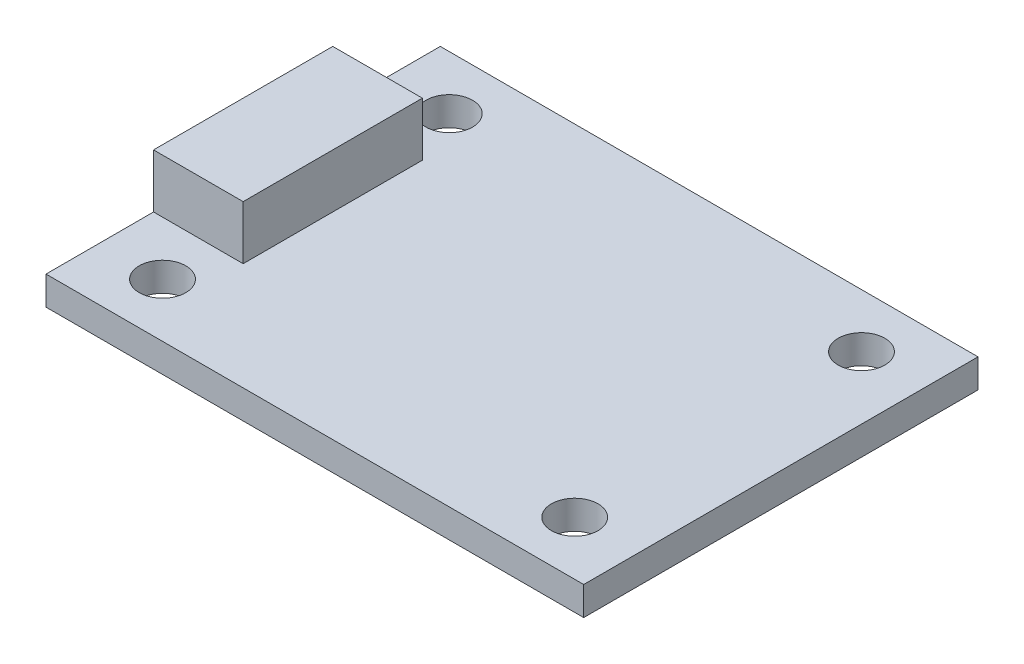
ISO-10303-21;
HEADER;
FILE_DESCRIPTION(('STEP AP214'),'2;1');
FILE_NAME('part.step','',(''),(''),'','','');
FILE_SCHEMA(('AUTOMOTIVE_DESIGN { 1 0 10303 214 1 1 1 1 }'));
ENDSEC;
DATA;
#1=APPLICATION_CONTEXT('core data for automotive mechanical design processes');
#2=APPLICATION_PROTOCOL_DEFINITION('international standard','automotive_design',2000,#1);
#3=PRODUCT_CONTEXT('',#1,'mechanical');
#4=PRODUCT('Part','Part','',(#3));
#5=PRODUCT_RELATED_PRODUCT_CATEGORY('part','',(#4));
#6=PRODUCT_DEFINITION_FORMATION('','',#4);
#7=PRODUCT_DEFINITION_CONTEXT('part definition',#1,'design');
#8=PRODUCT_DEFINITION('design','',#6,#7);
#9=PRODUCT_DEFINITION_SHAPE('','',#8);
#10=(LENGTH_UNIT() NAMED_UNIT(*) SI_UNIT(.MILLI.,.METRE.));
#11=(NAMED_UNIT(*) PLANE_ANGLE_UNIT() SI_UNIT($,.RADIAN.));
#12=(NAMED_UNIT(*) SI_UNIT($,.STERADIAN.) SOLID_ANGLE_UNIT());
#13=UNCERTAINTY_MEASURE_WITH_UNIT(LENGTH_MEASURE(1.E-05),#10,'distance_accuracy_value','');
#14=(GEOMETRIC_REPRESENTATION_CONTEXT(3) GLOBAL_UNCERTAINTY_ASSIGNED_CONTEXT((#13)) GLOBAL_UNIT_ASSIGNED_CONTEXT((#10,
#11,#12)) REPRESENTATION_CONTEXT('',''));
#15=CARTESIAN_POINT('',(0.,0.,0.));
#16=DIRECTION('',(0.,0.,1.));
#17=DIRECTION('',(1.,0.,0.));
#18=AXIS2_PLACEMENT_3D('',#15,#16,#17);
#19=CARTESIAN_POINT('',(0.,1.6,0.));
#20=DIRECTION('',(0.,-1.,0.));
#21=DIRECTION('',(0.,0.,-1.));
#22=AXIS2_PLACEMENT_3D('',#19,#20,#21);
#23=PLANE('',#22);
#24=CARTESIAN_POINT('',(3.49999999999999,1.6,-19.));
#25=DIRECTION('',(0.,1.,0.));
#26=DIRECTION('',(0.,0.,-1.));
#27=AXIS2_PLACEMENT_3D('',#24,#25,#26);
#28=CIRCLE('',#27,1.3);
#29=CARTESIAN_POINT('',(3.49999999999999,1.6,-20.3));
#30=VERTEX_POINT('',#29);
#31=EDGE_CURVE('E129',#30,#30,#28,.T.);
#32=ORIENTED_EDGE('',*,*,#31,.F.);
#33=EDGE_LOOP('',(#32));
#34=FACE_BOUND('',#33,.T.);
#35=CARTESIAN_POINT('',(26.5,1.6,-19.));
#36=DIRECTION('',(0.,1.,0.));
#37=DIRECTION('',(0.,0.,-1.));
#38=AXIS2_PLACEMENT_3D('',#35,#36,#37);
#39=CIRCLE('',#38,1.3);
#40=CARTESIAN_POINT('',(26.5,1.6,-20.3));
#41=VERTEX_POINT('',#40);
#42=EDGE_CURVE('E138',#41,#41,#39,.T.);
#43=ORIENTED_EDGE('',*,*,#42,.F.);
#44=EDGE_LOOP('',(#43));
#45=FACE_BOUND('',#44,.T.);
#46=CARTESIAN_POINT('',(26.5,1.6,-3.));
#47=DIRECTION('',(0.,1.,0.));
#48=DIRECTION('',(0.,0.,1.));
#49=AXIS2_PLACEMENT_3D('',#46,#47,#48);
#50=CIRCLE('',#49,1.3);
#51=CARTESIAN_POINT('',(26.5,1.6,-1.7));
#52=VERTEX_POINT('',#51);
#53=EDGE_CURVE('E144',#52,#52,#50,.T.);
#54=ORIENTED_EDGE('',*,*,#53,.F.);
#55=EDGE_LOOP('',(#54));
#56=FACE_BOUND('',#55,.T.);
#57=CARTESIAN_POINT('',(3.49999999999999,1.6,-3.));
#58=DIRECTION('',(0.,1.,0.));
#59=DIRECTION('',(0.,0.,1.));
#60=AXIS2_PLACEMENT_3D('',#57,#58,#59);
#61=CIRCLE('',#60,1.3);
#62=CARTESIAN_POINT('',(3.49999999999999,1.6,-1.7));
#63=VERTEX_POINT('',#62);
#64=EDGE_CURVE('E150',#63,#63,#61,.T.);
#65=ORIENTED_EDGE('',*,*,#64,.F.);
#66=EDGE_LOOP('',(#65));
#67=FACE_BOUND('',#66,.T.);
#68=DIRECTION('',(-1.,0.,0.));
#69=VECTOR('',#68,1.);
#70=CARTESIAN_POINT('',(0.,1.6,-16.));
#71=LINE('',#70,#69);
#72=CARTESIAN_POINT('',(5.,1.6,-16.));
#73=VERTEX_POINT('',#72);
#74=CARTESIAN_POINT('',(0.,1.6,-16.));
#75=VERTEX_POINT('',#74);
#76=EDGE_CURVE('E54',#73,#75,#71,.T.);
#77=ORIENTED_EDGE('',*,*,#76,.F.);
#78=DIRECTION('',(0.,0.,-1.));
#79=VECTOR('',#78,1.);
#80=CARTESIAN_POINT('',(5.,1.6,-16.));
#81=LINE('',#80,#79);
#82=CARTESIAN_POINT('',(5.,1.6,-5.99999999999999));
#83=VERTEX_POINT('',#82);
#84=EDGE_CURVE('E200',#83,#73,#81,.T.);
#85=ORIENTED_EDGE('',*,*,#84,.F.);
#86=DIRECTION('',(1.,0.,0.));
#87=VECTOR('',#86,1.);
#88=CARTESIAN_POINT('',(0.,1.6,-5.99999999999999));
#89=LINE('',#88,#87);
#90=CARTESIAN_POINT('',(0.,1.6,-5.99999999999999));
#91=VERTEX_POINT('',#90);
#92=EDGE_CURVE('E60',#91,#83,#89,.T.);
#93=ORIENTED_EDGE('',*,*,#92,.F.);
#94=DIRECTION('',(0.,0.,1.));
#95=VECTOR('',#94,1.);
#96=CARTESIAN_POINT('',(0.,1.6,0.));
#97=LINE('',#96,#95);
#98=CARTESIAN_POINT('',(0.,1.6,0.));
#99=VERTEX_POINT('',#98);
#100=EDGE_CURVE('E125',#91,#99,#97,.T.);
#101=ORIENTED_EDGE('',*,*,#100,.T.);
#102=DIRECTION('',(1.,0.,0.));
#103=VECTOR('',#102,1.);
#104=CARTESIAN_POINT('',(0.,1.6,0.));
#105=LINE('',#104,#103);
#106=CARTESIAN_POINT('',(30.,1.6,0.));
#107=VERTEX_POINT('',#106);
#108=EDGE_CURVE('E158',#99,#107,#105,.T.);
#109=ORIENTED_EDGE('',*,*,#108,.T.);
#110=DIRECTION('',(0.,0.,-1.));
#111=VECTOR('',#110,1.);
#112=CARTESIAN_POINT('',(30.,1.6,0.));
#113=LINE('',#112,#111);
#114=CARTESIAN_POINT('',(30.,1.6,-22.));
#115=VERTEX_POINT('',#114);
#116=EDGE_CURVE('E160',#107,#115,#113,.T.);
#117=ORIENTED_EDGE('',*,*,#116,.T.);
#118=DIRECTION('',(-1.,0.,0.));
#119=VECTOR('',#118,1.);
#120=CARTESIAN_POINT('',(0.,1.6,-22.));
#121=LINE('',#120,#119);
#122=CARTESIAN_POINT('',(0.,1.6,-22.));
#123=VERTEX_POINT('',#122);
#124=EDGE_CURVE('E162',#115,#123,#121,.T.);
#125=ORIENTED_EDGE('',*,*,#124,.T.);
#126=EDGE_CURVE('E156',#123,#75,#97,.T.);
#127=ORIENTED_EDGE('',*,*,#126,.T.);
#128=EDGE_LOOP('',(#77,#85,#93,#101,#109,#117,#125,#127));
#129=FACE_BOUND('',#128,.T.);
#130=ADVANCED_FACE('F39',(#34,#45,#56,#67,#129),#23,.F.);
#131=CARTESIAN_POINT('',(0.,0.,0.));
#132=DIRECTION('',(0.,-1.,0.));
#133=DIRECTION('',(0.,0.,-1.));
#134=AXIS2_PLACEMENT_3D('',#131,#132,#133);
#135=PLANE('',#134);
#136=CARTESIAN_POINT('',(26.5,0.,-19.));
#137=DIRECTION('',(0.,1.,0.));
#138=DIRECTION('',(0.,0.,-1.));
#139=AXIS2_PLACEMENT_3D('',#136,#137,#138);
#140=CIRCLE('',#139,1.3);
#141=CARTESIAN_POINT('',(26.5,0.,-20.3));
#142=VERTEX_POINT('',#141);
#143=EDGE_CURVE('E136',#142,#142,#140,.T.);
#144=ORIENTED_EDGE('',*,*,#143,.T.);
#145=EDGE_LOOP('',(#144));
#146=FACE_BOUND('',#145,.T.);
#147=CARTESIAN_POINT('',(3.49999999999999,0.,-3.));
#148=DIRECTION('',(0.,1.,0.));
#149=DIRECTION('',(0.,0.,1.));
#150=AXIS2_PLACEMENT_3D('',#147,#148,#149);
#151=CIRCLE('',#150,1.3);
#152=CARTESIAN_POINT('',(3.49999999999999,0.,-1.7));
#153=VERTEX_POINT('',#152);
#154=EDGE_CURVE('E147',#153,#153,#151,.T.);
#155=ORIENTED_EDGE('',*,*,#154,.T.);
#156=EDGE_LOOP('',(#155));
#157=FACE_BOUND('',#156,.T.);
#158=DIRECTION('',(0.,0.,1.));
#159=VECTOR('',#158,1.);
#160=CARTESIAN_POINT('',(0.,0.,0.));
#161=LINE('',#160,#159);
#162=CARTESIAN_POINT('',(0.,0.,-22.));
#163=VERTEX_POINT('',#162);
#164=CARTESIAN_POINT('',(0.,0.,0.));
#165=VERTEX_POINT('',#164);
#166=EDGE_CURVE('E153',#163,#165,#161,.T.);
#167=ORIENTED_EDGE('',*,*,#166,.F.);
#168=DIRECTION('',(-1.,0.,0.));
#169=VECTOR('',#168,1.);
#170=CARTESIAN_POINT('',(0.,0.,-22.));
#171=LINE('',#170,#169);
#172=CARTESIAN_POINT('',(30.,0.,-22.));
#173=VERTEX_POINT('',#172);
#174=EDGE_CURVE('E170',#173,#163,#171,.T.);
#175=ORIENTED_EDGE('',*,*,#174,.F.);
#176=DIRECTION('',(0.,0.,-1.));
#177=VECTOR('',#176,1.);
#178=CARTESIAN_POINT('',(30.,0.,0.));
#179=LINE('',#178,#177);
#180=CARTESIAN_POINT('',(30.,0.,0.));
#181=VERTEX_POINT('',#180);
#182=EDGE_CURVE('E168',#181,#173,#179,.T.);
#183=ORIENTED_EDGE('',*,*,#182,.F.);
#184=DIRECTION('',(1.,0.,0.));
#185=VECTOR('',#184,1.);
#186=CARTESIAN_POINT('',(0.,0.,0.));
#187=LINE('',#186,#185);
#188=EDGE_CURVE('E166',#165,#181,#187,.T.);
#189=ORIENTED_EDGE('',*,*,#188,.F.);
#190=EDGE_LOOP('',(#167,#175,#183,#189));
#191=FACE_BOUND('',#190,.T.);
#192=CARTESIAN_POINT('',(26.5,0.,-3.));
#193=DIRECTION('',(0.,1.,0.));
#194=DIRECTION('',(0.,0.,1.));
#195=AXIS2_PLACEMENT_3D('',#192,#193,#194);
#196=CIRCLE('',#195,1.3);
#197=CARTESIAN_POINT('',(26.5,0.,-1.7));
#198=VERTEX_POINT('',#197);
#199=EDGE_CURVE('E141',#198,#198,#196,.T.);
#200=ORIENTED_EDGE('',*,*,#199,.T.);
#201=EDGE_LOOP('',(#200));
#202=FACE_BOUND('',#201,.T.);
#203=CARTESIAN_POINT('',(3.49999999999999,0.,-19.));
#204=DIRECTION('',(0.,1.,0.));
#205=DIRECTION('',(0.,0.,-1.));
#206=AXIS2_PLACEMENT_3D('',#203,#204,#205);
#207=CIRCLE('',#206,1.3);
#208=CARTESIAN_POINT('',(3.49999999999999,0.,-20.3));
#209=VERTEX_POINT('',#208);
#210=EDGE_CURVE('E126',#209,#209,#207,.T.);
#211=ORIENTED_EDGE('',*,*,#210,.T.);
#212=EDGE_LOOP('',(#211));
#213=FACE_BOUND('',#212,.T.);
#214=ADVANCED_FACE('F188',(#146,#157,#191,#202,#213),#135,.T.);
#215=CARTESIAN_POINT('',(0.,1.6,0.));
#216=DIRECTION('',(1.,0.,0.));
#217=DIRECTION('',(0.,0.,-1.));
#218=AXIS2_PLACEMENT_3D('',#215,#216,#217);
#219=PLANE('',#218);
#220=ORIENTED_EDGE('',*,*,#166,.T.);
#221=DIRECTION('',(0.,-1.,0.));
#222=VECTOR('',#221,1.);
#223=CARTESIAN_POINT('',(0.,1.6,0.));
#224=LINE('',#223,#222);
#225=EDGE_CURVE('E11',#99,#165,#224,.T.);
#226=ORIENTED_EDGE('',*,*,#225,.F.);
#227=ORIENTED_EDGE('',*,*,#100,.F.);
#228=DIRECTION('',(0.,-1.,0.));
#229=VECTOR('',#228,1.);
#230=CARTESIAN_POINT('',(0.,4.6,-5.99999999999999));
#231=LINE('',#230,#229);
#232=CARTESIAN_POINT('',(0.,4.6,-5.99999999999999));
#233=VERTEX_POINT('',#232);
#234=EDGE_CURVE('E107',#233,#91,#231,.T.);
#235=ORIENTED_EDGE('',*,*,#234,.F.);
#236=DIRECTION('',(0.,0.,1.));
#237=VECTOR('',#236,1.);
#238=CARTESIAN_POINT('',(0.,4.6,-16.));
#239=LINE('',#238,#237);
#240=CARTESIAN_POINT('',(0.,4.6,-16.));
#241=VERTEX_POINT('',#240);
#242=EDGE_CURVE('E113',#241,#233,#239,.T.);
#243=ORIENTED_EDGE('',*,*,#242,.F.);
#244=DIRECTION('',(0.,-1.,0.));
#245=VECTOR('',#244,1.);
#246=CARTESIAN_POINT('',(0.,4.6,-16.));
#247=LINE('',#246,#245);
#248=EDGE_CURVE('E195',#241,#75,#247,.T.);
#249=ORIENTED_EDGE('',*,*,#248,.T.);
#250=ORIENTED_EDGE('',*,*,#126,.F.);
#251=DIRECTION('',(0.,-1.,0.));
#252=VECTOR('',#251,1.);
#253=CARTESIAN_POINT('',(0.,1.6,-22.));
#254=LINE('',#253,#252);
#255=EDGE_CURVE('E164',#123,#163,#254,.T.);
#256=ORIENTED_EDGE('',*,*,#255,.T.);
#257=EDGE_LOOP('',(#220,#226,#227,#235,#243,#249,#250,#256));
#258=FACE_BOUND('',#257,.T.);
#259=ADVANCED_FACE('F41',(#258),#219,.F.);
#260=CARTESIAN_POINT('',(0.,1.6,0.));
#261=DIRECTION('',(0.,0.,-1.));
#262=DIRECTION('',(-1.,0.,0.));
#263=AXIS2_PLACEMENT_3D('',#260,#261,#262);
#264=PLANE('',#263);
#265=ORIENTED_EDGE('',*,*,#188,.T.);
#266=DIRECTION('',(0.,-1.,0.));
#267=VECTOR('',#266,1.);
#268=CARTESIAN_POINT('',(30.,1.6,0.));
#269=LINE('',#268,#267);
#270=EDGE_CURVE('E47',#107,#181,#269,.T.);
#271=ORIENTED_EDGE('',*,*,#270,.F.);
#272=ORIENTED_EDGE('',*,*,#108,.F.);
#273=ORIENTED_EDGE('',*,*,#225,.T.);
#274=EDGE_LOOP('',(#265,#271,#272,#273));
#275=FACE_BOUND('',#274,.T.);
#276=ADVANCED_FACE('F235',(#275),#264,.F.);
#277=CARTESIAN_POINT('',(30.,1.6,0.));
#278=DIRECTION('',(-1.,0.,0.));
#279=DIRECTION('',(0.,0.,1.));
#280=AXIS2_PLACEMENT_3D('',#277,#278,#279);
#281=PLANE('',#280);
#282=ORIENTED_EDGE('',*,*,#182,.T.);
#283=DIRECTION('',(0.,-1.,0.));
#284=VECTOR('',#283,1.);
#285=CARTESIAN_POINT('',(30.,1.6,-22.));
#286=LINE('',#285,#284);
#287=EDGE_CURVE('E174',#115,#173,#286,.T.);
#288=ORIENTED_EDGE('',*,*,#287,.F.);
#289=ORIENTED_EDGE('',*,*,#116,.F.);
#290=ORIENTED_EDGE('',*,*,#270,.T.);
#291=EDGE_LOOP('',(#282,#288,#289,#290));
#292=FACE_BOUND('',#291,.T.);
#293=ADVANCED_FACE('F181',(#292),#281,.F.);
#294=CARTESIAN_POINT('',(0.,1.6,-22.));
#295=DIRECTION('',(0.,0.,1.));
#296=DIRECTION('',(1.,0.,0.));
#297=AXIS2_PLACEMENT_3D('',#294,#295,#296);
#298=PLANE('',#297);
#299=ORIENTED_EDGE('',*,*,#174,.T.);
#300=ORIENTED_EDGE('',*,*,#255,.F.);
#301=ORIENTED_EDGE('',*,*,#124,.F.);
#302=ORIENTED_EDGE('',*,*,#287,.T.);
#303=EDGE_LOOP('',(#299,#300,#301,#302));
#304=FACE_BOUND('',#303,.T.);
#305=ADVANCED_FACE('F192',(#304),#298,.F.);
#306=CARTESIAN_POINT('',(3.49999999999999,1.6,-3.));
#307=DIRECTION('',(0.,-1.,0.));
#308=DIRECTION('',(0.,0.,-1.));
#309=AXIS2_PLACEMENT_3D('',#306,#307,#308);
#310=CYLINDRICAL_SURFACE('',#309,1.3);
#311=ORIENTED_EDGE('',*,*,#64,.T.);
#312=EDGE_LOOP('',(#311));
#313=FACE_BOUND('',#312,.T.);
#314=ORIENTED_EDGE('',*,*,#154,.F.);
#315=EDGE_LOOP('',(#314));
#316=FACE_BOUND('',#315,.T.);
#317=ADVANCED_FACE('F229',(#313,#316),#310,.F.);
#318=CARTESIAN_POINT('',(26.5,1.6,-3.));
#319=DIRECTION('',(0.,-1.,0.));
#320=DIRECTION('',(0.,0.,-1.));
#321=AXIS2_PLACEMENT_3D('',#318,#319,#320);
#322=CYLINDRICAL_SURFACE('',#321,1.3);
#323=ORIENTED_EDGE('',*,*,#53,.T.);
#324=EDGE_LOOP('',(#323));
#325=FACE_BOUND('',#324,.T.);
#326=ORIENTED_EDGE('',*,*,#199,.F.);
#327=EDGE_LOOP('',(#326));
#328=FACE_BOUND('',#327,.T.);
#329=ADVANCED_FACE('F277',(#325,#328),#322,.F.);
#330=CARTESIAN_POINT('',(26.5,1.6,-19.));
#331=DIRECTION('',(0.,-1.,0.));
#332=DIRECTION('',(0.,0.,-1.));
#333=AXIS2_PLACEMENT_3D('',#330,#331,#332);
#334=CYLINDRICAL_SURFACE('',#333,1.3);
#335=ORIENTED_EDGE('',*,*,#42,.T.);
#336=EDGE_LOOP('',(#335));
#337=FACE_BOUND('',#336,.T.);
#338=ORIENTED_EDGE('',*,*,#143,.F.);
#339=EDGE_LOOP('',(#338));
#340=FACE_BOUND('',#339,.T.);
#341=ADVANCED_FACE('F287',(#337,#340),#334,.F.);
#342=CARTESIAN_POINT('',(3.49999999999999,1.6,-19.));
#343=DIRECTION('',(0.,-1.,0.));
#344=DIRECTION('',(0.,0.,-1.));
#345=AXIS2_PLACEMENT_3D('',#342,#343,#344);
#346=CYLINDRICAL_SURFACE('',#345,1.3);
#347=ORIENTED_EDGE('',*,*,#31,.T.);
#348=EDGE_LOOP('',(#347));
#349=FACE_BOUND('',#348,.T.);
#350=ORIENTED_EDGE('',*,*,#210,.F.);
#351=EDGE_LOOP('',(#350));
#352=FACE_BOUND('',#351,.T.);
#353=ADVANCED_FACE('F216',(#349,#352),#346,.F.);
#354=CARTESIAN_POINT('',(0.,4.6,-5.99999999999999));
#355=DIRECTION('',(0.,0.,-1.));
#356=DIRECTION('',(-1.,0.,0.));
#357=AXIS2_PLACEMENT_3D('',#354,#355,#356);
#358=PLANE('',#357);
#359=ORIENTED_EDGE('',*,*,#92,.T.);
#360=DIRECTION('',(0.,-1.,0.));
#361=VECTOR('',#360,1.);
#362=CARTESIAN_POINT('',(5.,4.6,-5.99999999999999));
#363=LINE('',#362,#361);
#364=CARTESIAN_POINT('',(5.,4.6,-5.99999999999999));
#365=VERTEX_POINT('',#364);
#366=EDGE_CURVE('E109',#365,#83,#363,.T.);
#367=ORIENTED_EDGE('',*,*,#366,.F.);
#368=DIRECTION('',(1.,0.,0.));
#369=VECTOR('',#368,1.);
#370=CARTESIAN_POINT('',(0.,4.6,-5.99999999999999));
#371=LINE('',#370,#369);
#372=EDGE_CURVE('E103',#233,#365,#371,.T.);
#373=ORIENTED_EDGE('',*,*,#372,.F.);
#374=ORIENTED_EDGE('',*,*,#234,.T.);
#375=EDGE_LOOP('',(#359,#367,#373,#374));
#376=FACE_BOUND('',#375,.T.);
#377=ADVANCED_FACE('F105',(#376),#358,.F.);
#378=CARTESIAN_POINT('',(5.,4.6,-16.));
#379=DIRECTION('',(-1.,0.,0.));
#380=DIRECTION('',(0.,0.,1.));
#381=AXIS2_PLACEMENT_3D('',#378,#379,#380);
#382=PLANE('',#381);
#383=ORIENTED_EDGE('',*,*,#84,.T.);
#384=DIRECTION('',(0.,-1.,0.));
#385=VECTOR('',#384,1.);
#386=CARTESIAN_POINT('',(5.,4.6,-16.));
#387=LINE('',#386,#385);
#388=CARTESIAN_POINT('',(5.,4.6,-16.));
#389=VERTEX_POINT('',#388);
#390=EDGE_CURVE('E131',#389,#73,#387,.T.);
#391=ORIENTED_EDGE('',*,*,#390,.F.);
#392=DIRECTION('',(0.,0.,-1.));
#393=VECTOR('',#392,1.);
#394=CARTESIAN_POINT('',(5.,4.6,-16.));
#395=LINE('',#394,#393);
#396=EDGE_CURVE('E112',#365,#389,#395,.T.);
#397=ORIENTED_EDGE('',*,*,#396,.F.);
#398=ORIENTED_EDGE('',*,*,#366,.T.);
#399=EDGE_LOOP('',(#383,#391,#397,#398));
#400=FACE_BOUND('',#399,.T.);
#401=ADVANCED_FACE('F208',(#400),#382,.F.);
#402=CARTESIAN_POINT('',(0.,4.6,-16.));
#403=DIRECTION('',(0.,0.,1.));
#404=DIRECTION('',(1.,0.,0.));
#405=AXIS2_PLACEMENT_3D('',#402,#403,#404);
#406=PLANE('',#405);
#407=ORIENTED_EDGE('',*,*,#76,.T.);
#408=ORIENTED_EDGE('',*,*,#248,.F.);
#409=DIRECTION('',(-1.,0.,0.));
#410=VECTOR('',#409,1.);
#411=CARTESIAN_POINT('',(0.,4.6,-16.));
#412=LINE('',#411,#410);
#413=EDGE_CURVE('E118',#389,#241,#412,.T.);
#414=ORIENTED_EDGE('',*,*,#413,.F.);
#415=ORIENTED_EDGE('',*,*,#390,.T.);
#416=EDGE_LOOP('',(#407,#408,#414,#415));
#417=FACE_BOUND('',#416,.T.);
#418=ADVANCED_FACE('F198',(#417),#406,.F.);
#419=CARTESIAN_POINT('',(0.,4.6,0.));
#420=DIRECTION('',(0.,1.,0.));
#421=DIRECTION('',(0.,0.,1.));
#422=AXIS2_PLACEMENT_3D('',#419,#420,#421);
#423=PLANE('',#422);
#424=ORIENTED_EDGE('',*,*,#242,.T.);
#425=ORIENTED_EDGE('',*,*,#372,.T.);
#426=ORIENTED_EDGE('',*,*,#396,.T.);
#427=ORIENTED_EDGE('',*,*,#413,.T.);
#428=EDGE_LOOP('',(#424,#425,#426,#427));
#429=FACE_BOUND('',#428,.T.);
#430=ADVANCED_FACE('F116',(#429),#423,.T.);
#431=CLOSED_SHELL('',(#130,#214,#259,#276,#293,#305,#317,#329,#341,#353,#377,#401,#418,#430));
#432=MANIFOLD_SOLID_BREP('B2',#431);
#433=ADVANCED_BREP_SHAPE_REPRESENTATION('',(#18,#432),#14);
#434=SHAPE_DEFINITION_REPRESENTATION(#9,#433);
ENDSEC;
END-ISO-10303-21;
